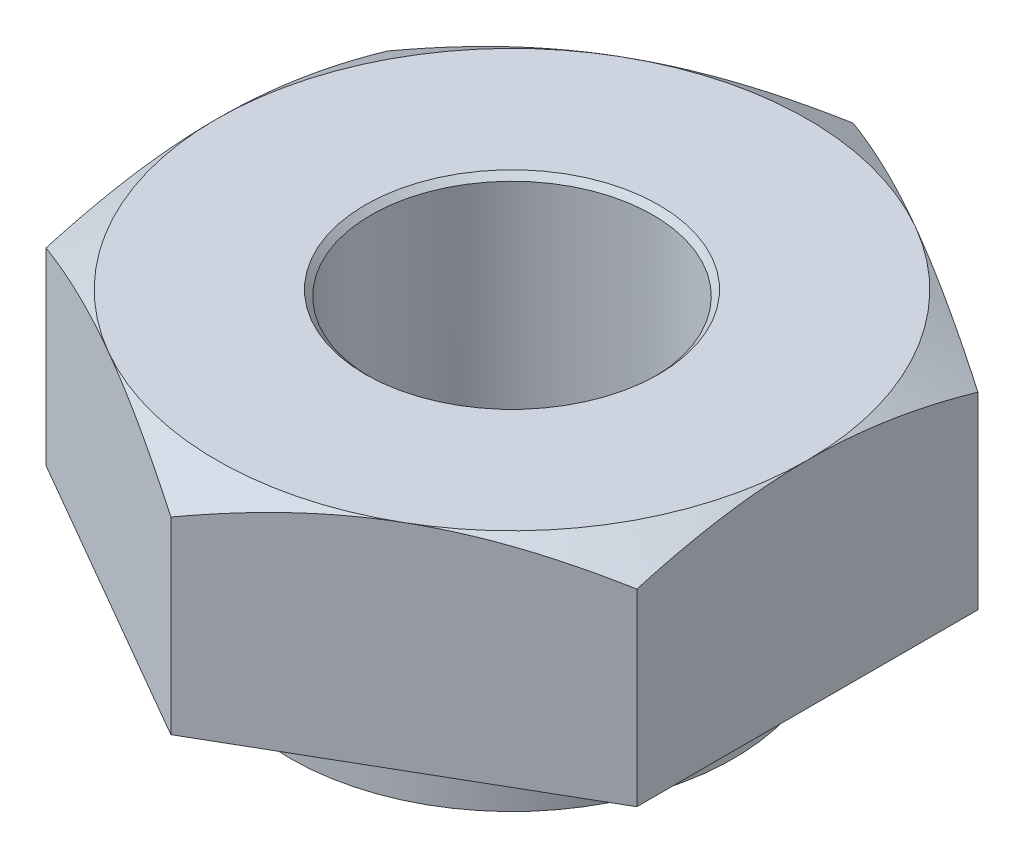
ISO-10303-21;
HEADER;
FILE_DESCRIPTION(('STEP AP214'),'2;1');
FILE_NAME('part.step','',(''),(''),'','','');
FILE_SCHEMA(('AUTOMOTIVE_DESIGN { 1 0 10303 214 1 1 1 1 }'));
ENDSEC;
DATA;
#1=APPLICATION_CONTEXT('core data for automotive mechanical design processes');
#2=APPLICATION_PROTOCOL_DEFINITION('international standard','automotive_design',2000,#1);
#3=PRODUCT_CONTEXT('',#1,'mechanical');
#4=PRODUCT('Part','Part','',(#3));
#5=PRODUCT_RELATED_PRODUCT_CATEGORY('part','',(#4));
#6=PRODUCT_DEFINITION_FORMATION('','',#4);
#7=PRODUCT_DEFINITION_CONTEXT('part definition',#1,'design');
#8=PRODUCT_DEFINITION('design','',#6,#7);
#9=PRODUCT_DEFINITION_SHAPE('','',#8);
#10=(LENGTH_UNIT() NAMED_UNIT(*) SI_UNIT(.MILLI.,.METRE.));
#11=(NAMED_UNIT(*) PLANE_ANGLE_UNIT() SI_UNIT($,.RADIAN.));
#12=(NAMED_UNIT(*) SI_UNIT($,.STERADIAN.) SOLID_ANGLE_UNIT());
#13=UNCERTAINTY_MEASURE_WITH_UNIT(LENGTH_MEASURE(1.E-05),#10,'distance_accuracy_value','');
#14=(GEOMETRIC_REPRESENTATION_CONTEXT(3) GLOBAL_UNCERTAINTY_ASSIGNED_CONTEXT((#13)) GLOBAL_UNIT_ASSIGNED_CONTEXT((#10,
#11,#12)) REPRESENTATION_CONTEXT('',''));
#15=CARTESIAN_POINT('',(0.,0.,0.));
#16=DIRECTION('',(0.,0.,1.));
#17=DIRECTION('',(1.,0.,0.));
#18=AXIS2_PLACEMENT_3D('',#15,#16,#17);
#19=CARTESIAN_POINT('',(4.365625,4.365625,-2.52049476893096));
#20=DIRECTION('',(-0.5,0.,0.866025403784439));
#21=DIRECTION('',(0.866025403784439,0.,0.5));
#22=AXIS2_PLACEMENT_3D('',#19,#20,#21);
#23=PLANE('',#22);
#24=DIRECTION('',(0.,-1.,0.));
#25=VECTOR('',#24,1.);
#26=CARTESIAN_POINT('',(4.365625,4.365625,-2.52049476893096));
#27=LINE('',#26,#25);
#28=CARTESIAN_POINT('',(4.365625,3.97570310226438,-2.52049476893108));
#29=VERTEX_POINT('',#28);
#30=CARTESIAN_POINT('',(4.365625,1.190625,-2.52049476893096));
#31=VERTEX_POINT('',#30);
#32=EDGE_CURVE('E119',#29,#31,#27,.T.);
#33=ORIENTED_EDGE('',*,*,#32,.T.);
#34=DIRECTION('',(-0.866025403784439,0.,-0.5));
#35=VECTOR('',#34,1.);
#36=CARTESIAN_POINT('',(4.365625,1.190625,-2.52049476893096));
#37=LINE('',#36,#35);
#38=CARTESIAN_POINT('',(0.,1.190625,-5.04098953786192));
#39=VERTEX_POINT('',#38);
#40=EDGE_CURVE('E50',#31,#39,#37,.T.);
#41=ORIENTED_EDGE('',*,*,#40,.T.);
#42=DIRECTION('',(0.,-1.,0.));
#43=VECTOR('',#42,1.);
#44=CARTESIAN_POINT('',(0.,4.365625,-5.04098953786192));
#45=LINE('',#44,#43);
#46=CARTESIAN_POINT('',(0.,3.9757031022643,-5.04098953786192));
#47=VERTEX_POINT('',#46);
#48=EDGE_CURVE('E116',#47,#39,#45,.T.);
#49=ORIENTED_EDGE('',*,*,#48,.F.);
#50=CARTESIAN_POINT('',(4.365825,3.97563643330706,-2.52037929887712));
#51=CARTESIAN_POINT('',(4.17397884524337,4.03960803939287,-2.63114172796886));
#52=CARTESIAN_POINT('',(3.98047668465206,4.09778770339327,-2.74286025247502));
#53=CARTESIAN_POINT('',(3.5901217278633,4.1993404789496,-2.96823179185652));
#54=CARTESIAN_POINT('',(3.39326199603345,4.24267766558374,-3.08188881102108));
#55=CARTESIAN_POINT('',(3.00198221769429,4.31013774711872,-3.30779429637365));
#56=CARTESIAN_POINT('',(2.80762237147349,4.3347096340745,-3.42000800590889));
#57=CARTESIAN_POINT('',(2.41798823215203,4.36404239318914,-3.6449633811316));
#58=CARTESIAN_POINT('',(2.2227153550983,4.3688275564277,-3.757704229264));
#59=CARTESIAN_POINT('',(1.85784257149213,4.35886837568916,-3.96836362909899));
#60=CARTESIAN_POINT('',(1.68818802211312,4.34656934705368,-4.06631372885221));
#61=CARTESIAN_POINT('',(1.34998421225434,4.30759000734802,-4.26157578951513));
#62=CARTESIAN_POINT('',(1.18143612140105,4.28089638313893,-4.35888707514068));
#63=CARTESIAN_POINT('',(0.842535099477599,4.21416492336617,-4.55455167137682));
#64=CARTESIAN_POINT('',(0.672225057879174,4.17384423834841,-4.65288021973937));
#65=CARTESIAN_POINT('',(0.334144990416697,4.08233234471812,-4.84807083769648));
#66=CARTESIAN_POINT('',(0.166370633837114,4.03116263580727,-4.94493540763081));
#67=CARTESIAN_POINT('',(-0.000200000000000026,3.97563643330706,-5.04110500791576));
#68=B_SPLINE_CURVE_WITH_KNOTS('',3,(#50,#51,#52,#53,#54,#55,#56,#57,#58,#59,#60,#61,#62,#63,#64,
#65,#66,#67),.UNSPECIFIED.,.F.,.F.,(4,2,2,2,2,2,2,2,4),(0.,0.692002325262095,1.38566793682621,
2.06216593124082,2.73783317900963,3.32613108280982,3.91497402160196,4.51687782793767,
5.11759979729738),.UNSPECIFIED.);
#69=CARTESIAN_POINT('',(2.1828125,4.365625,-3.78074215339644));
#70=VERTEX_POINT('',#69);
#71=EDGE_CURVE('E210',#70,#47,#68,.T.);
#72=ORIENTED_EDGE('',*,*,#71,.F.);
#73=EDGE_CURVE('E336',#29,#70,#68,.T.);
#74=ORIENTED_EDGE('',*,*,#73,.F.);
#75=EDGE_LOOP('',(#33,#41,#49,#72,#74));
#76=FACE_BOUND('',#75,.T.);
#77=ADVANCED_FACE('F35',(#76),#23,.F.);
#78=CARTESIAN_POINT('',(0.,4.365625,-5.04098953786192));
#79=DIRECTION('',(0.5,0.,0.866025403784439));
#80=DIRECTION('',(0.866025403784439,0.,-0.5));
#81=AXIS2_PLACEMENT_3D('',#78,#79,#80);
#82=PLANE('',#81);
#83=ORIENTED_EDGE('',*,*,#48,.T.);
#84=DIRECTION('',(-0.866025403784439,0.,0.5));
#85=VECTOR('',#84,1.);
#86=CARTESIAN_POINT('',(0.,1.190625,-5.04098953786192));
#87=LINE('',#86,#85);
#88=CARTESIAN_POINT('',(-4.365625,1.190625,-2.52049476893097));
#89=VERTEX_POINT('',#88);
#90=EDGE_CURVE('E103',#39,#89,#87,.T.);
#91=ORIENTED_EDGE('',*,*,#90,.T.);
#92=DIRECTION('',(0.,-1.,0.));
#93=VECTOR('',#92,1.);
#94=CARTESIAN_POINT('',(-4.365625,4.365625,-2.52049476893096));
#95=LINE('',#94,#93);
#96=CARTESIAN_POINT('',(-4.365625,3.97570310226438,-2.52049476893108));
#97=VERTEX_POINT('',#96);
#98=EDGE_CURVE('E127',#97,#89,#95,.T.);
#99=ORIENTED_EDGE('',*,*,#98,.F.);
#100=CARTESIAN_POINT('',(0.000200000000000096,3.97563643330706,-5.04110500791576));
#101=CARTESIAN_POINT('',(-0.191646154756632,4.03960803939287,-4.93034257882402));
#102=CARTESIAN_POINT('',(-0.385148315347934,4.09778770339327,-4.81862405431786));
#103=CARTESIAN_POINT('',(-0.775503272136697,4.1993404789496,-4.59325251493636));
#104=CARTESIAN_POINT('',(-0.97236300396655,4.24267766558374,-4.4795954957718));
#105=CARTESIAN_POINT('',(-1.36364278230571,4.31013774711872,-4.25369001041923));
#106=CARTESIAN_POINT('',(-1.55800262852651,4.3347096340745,-4.141476300884));
#107=CARTESIAN_POINT('',(-1.94763676784797,4.36404239318914,-3.91652092566128));
#108=CARTESIAN_POINT('',(-2.1429096449017,4.3688275564277,-3.80378007752888));
#109=CARTESIAN_POINT('',(-2.50778242850786,4.35886837568916,-3.59312067769389));
#110=CARTESIAN_POINT('',(-2.67743697788687,4.34656934705368,-3.49517057794068));
#111=CARTESIAN_POINT('',(-3.01564078774565,4.30759000734802,-3.29990851727775));
#112=CARTESIAN_POINT('',(-3.18418887859895,4.28089638313893,-3.2025972316522));
#113=CARTESIAN_POINT('',(-3.5230899005224,4.21416492336617,-3.00693263541606));
#114=CARTESIAN_POINT('',(-3.69339994212082,4.17384423834841,-2.90860408705351));
#115=CARTESIAN_POINT('',(-4.0314800095833,4.08233234471812,-2.7134134690964));
#116=CARTESIAN_POINT('',(-4.19925436616289,4.03116263580728,-2.61654889916207));
#117=CARTESIAN_POINT('',(-4.365825,3.97563643330706,-2.52037929887712));
#118=B_SPLINE_CURVE_WITH_KNOTS('',3,(#100,#101,#102,#103,#104,#105,#106,#107,#108,#109,#110,
#111,#112,#113,#114,#115,#116,#117),.UNSPECIFIED.,.F.,.F.,(4,2,2,2,2,2,2,2,4),(0.,
0.692002325262095,1.38566793682621,2.06216593124082,2.73783317900963,3.32613108280982,
3.91497402160196,4.51687782793768,5.11759979729738),.UNSPECIFIED.);
#119=CARTESIAN_POINT('',(-2.1828125,4.365625,-3.78074215339644));
#120=VERTEX_POINT('',#119);
#121=EDGE_CURVE('E204',#120,#97,#118,.T.);
#122=ORIENTED_EDGE('',*,*,#121,.F.);
#123=EDGE_CURVE('E125',#47,#120,#118,.T.);
#124=ORIENTED_EDGE('',*,*,#123,.F.);
#125=EDGE_LOOP('',(#83,#91,#99,#122,#124));
#126=FACE_BOUND('',#125,.T.);
#127=ADVANCED_FACE('F123',(#126),#82,.F.);
#128=CARTESIAN_POINT('',(-4.365625,4.365625,-2.52049476893096));
#129=DIRECTION('',(1.,0.,0.));
#130=DIRECTION('',(0.,0.,-1.));
#131=AXIS2_PLACEMENT_3D('',#128,#129,#130);
#132=PLANE('',#131);
#133=ORIENTED_EDGE('',*,*,#98,.T.);
#134=DIRECTION('',(0.,0.,1.));
#135=VECTOR('',#134,1.);
#136=CARTESIAN_POINT('',(-4.365625,1.190625,-2.52049476893096));
#137=LINE('',#136,#135);
#138=CARTESIAN_POINT('',(-4.365625,1.19062499999999,2.52049476893096));
#139=VERTEX_POINT('',#138);
#140=EDGE_CURVE('E106',#89,#139,#137,.T.);
#141=ORIENTED_EDGE('',*,*,#140,.T.);
#142=DIRECTION('',(0.,-1.,0.));
#143=VECTOR('',#142,1.);
#144=CARTESIAN_POINT('',(-4.365625,4.365625,2.52049476893096));
#145=LINE('',#144,#143);
#146=CARTESIAN_POINT('',(-4.365625,3.9757031022643,2.52049476893096));
#147=VERTEX_POINT('',#146);
#148=EDGE_CURVE('E132',#147,#139,#145,.T.);
#149=ORIENTED_EDGE('',*,*,#148,.F.);
#150=CARTESIAN_POINT('',(-4.365625,2.16572492391831,-6.91286487918296));
#151=CARTESIAN_POINT('',(-4.365625,2.25939640330489,-6.72092648409264));
#152=CARTESIAN_POINT('',(-4.365625,2.35220994582686,-6.52856244945873));
#153=CARTESIAN_POINT('',(-4.365625,2.53564124723088,-6.14275722466381));
#154=CARTESIAN_POINT('',(-4.365625,2.62625868579093,-5.94931588236799));
#155=CARTESIAN_POINT('',(-4.365625,2.80524365491005,-5.5602003718446));
#156=CARTESIAN_POINT('',(-4.365625,2.89359742579855,-5.36451985359358));
#157=CARTESIAN_POINT('',(-4.365625,3.06687407175193,-4.97165125492876));
#158=CARTESIAN_POINT('',(-4.365625,3.15179710002251,-4.77446324230341));
#159=CARTESIAN_POINT('',(-4.365625,3.32017003092573,-4.37142262621219));
#160=CARTESIAN_POINT('',(-4.365625,3.40346763443347,-4.16550606509893));
#161=CARTESIAN_POINT('',(-4.365625,3.56409666510129,-3.75131708170349));
#162=CARTESIAN_POINT('',(-4.365625,3.64142744315579,-3.54304440592748));
#163=CARTESIAN_POINT('',(-4.365625,3.78819674807172,-3.12415754336475));
#164=CARTESIAN_POINT('',(-4.365625,3.85765008517104,-2.91354859615939));
#165=CARTESIAN_POINT('',(-4.365625,3.98653079619726,-2.48931284525827));
#166=CARTESIAN_POINT('',(-4.365625,4.04596118051565,-2.27568696866249));
#167=CARTESIAN_POINT('',(-4.365625,4.15172155816293,-1.84648791656792));
#168=CARTESIAN_POINT('',(-4.365625,4.19812629326434,-1.63093349319846));
#169=CARTESIAN_POINT('',(-4.365625,4.27531019510395,-1.1970012210497));
#170=CARTESIAN_POINT('',(-4.365625,4.30609111295987,-0.978623691498865));
#171=CARTESIAN_POINT('',(-4.365625,4.34917706920352,-0.543043666964697));
#172=CARTESIAN_POINT('',(-4.365625,4.36173059768355,-0.325866375264969));
#173=CARTESIAN_POINT('',(-4.365625,4.36796158588117,0.108783677786554));
#174=CARTESIAN_POINT('',(-4.365625,4.36163884772114,0.326256442211867));
#175=CARTESIAN_POINT('',(-4.365625,4.33564006573077,0.691321614157379));
#176=CARTESIAN_POINT('',(-4.365625,4.32081408812231,0.8392839207881));
#177=CARTESIAN_POINT('',(-4.365625,4.28327272636649,1.13421073362511));
#178=CARTESIAN_POINT('',(-4.365625,4.26055638826924,1.28117511699037));
#179=CARTESIAN_POINT('',(-4.365625,4.18175717110547,1.72032394223359));
#180=CARTESIAN_POINT('',(-4.365625,4.11503535369022,2.01062534550366));
#181=CARTESIAN_POINT('',(-4.365625,3.998231496302,2.44499178314794));
#182=CARTESIAN_POINT('',(-4.365625,3.95592239433218,2.59127602608044));
#183=CARTESIAN_POINT('',(-4.365625,3.86663520230625,2.88242647249444));
#184=CARTESIAN_POINT('',(-4.365625,3.81965707493026,3.02729266463119));
#185=CARTESIAN_POINT('',(-4.365625,3.72180823318134,3.31564955019008));
#186=CARTESIAN_POINT('',(-4.365625,3.67093854782101,3.45914059601571));
#187=CARTESIAN_POINT('',(-4.365625,3.56593233241395,3.74491408963176));
#188=CARTESIAN_POINT('',(-4.365625,3.51179588580739,3.88719656818582));
#189=CARTESIAN_POINT('',(-4.365625,3.35825599775331,4.27934008293896));
#190=CARTESIAN_POINT('',(-4.365625,3.25596105343501,4.52806806625827));
#191=CARTESIAN_POINT('',(-4.365625,3.04511006757158,5.02286623174984));
#192=CARTESIAN_POINT('',(-4.365625,2.93655324949615,5.26893607977706));
#193=CARTESIAN_POINT('',(-4.365625,2.71470144477202,5.75904913604779));
#194=CARTESIAN_POINT('',(-4.365625,2.60140446291119,6.00309143799433));
#195=CARTESIAN_POINT('',(-4.365625,2.37123826126673,6.489465773805));
#196=CARTESIAN_POINT('',(-4.365625,2.25436920579252,6.73179788570576));
#197=CARTESIAN_POINT('',(-4.365625,2.0176526640704,7.21552016103529));
#198=CARTESIAN_POINT('',(-4.365625,1.89780037219463,7.45690796773571));
#199=CARTESIAN_POINT('',(-4.365625,1.65589745434077,7.93858025300455));
#200=CARTESIAN_POINT('',(-4.365625,1.53384680760269,8.17886472112679));
#201=CARTESIAN_POINT('',(-4.365625,1.16514515877594,8.89826072499817));
#202=CARTESIAN_POINT('',(-4.365625,0.915885312273444,9.37603448937885));
#203=CARTESIAN_POINT('',(-4.365625,0.4405080584456,10.2765865021301));
#204=CARTESIAN_POINT('',(-4.365625,0.214869980290046,10.6996190313308));
#205=CARTESIAN_POINT('',(-4.365625,-0.239078846783825,11.5442843842997));
#206=CARTESIAN_POINT('',(-4.365625,-0.467389778110095,11.9659171099886));
#207=CARTESIAN_POINT('',(-4.365625,-0.925162645350592,12.8066083777368));
#208=CARTESIAN_POINT('',(-4.365625,-1.15461757917514,13.2256707385857));
#209=CARTESIAN_POINT('',(-4.365625,-1.61502984154572,14.0629229586093));
#210=CARTESIAN_POINT('',(-4.365625,-1.8459870398419,14.4811128893808));
#211=CARTESIAN_POINT('',(-4.365625,-2.07748916003773,14.8989990755701));
#212=B_SPLINE_CURVE_WITH_KNOTS('',3,(#150,#151,#152,#153,#154,#155,#156,#157,#158,#159,#160,
#161,#162,#163,#164,#165,#166,#167,#168,#169,#170,#171,#172,#173,#174,#175,#176,#177,#178,#179,
#180,#181,#182,#183,#184,#185,#186,#187,#188,#189,#190,#191,#192,#193,#194,#195,#196,#197,#198,
#199,#200,#201,#202,#203,#204,#205,#206,#207,#208,#209,#210,#211),.UNSPECIFIED.,.F.,.F.,(4,2,2,
2,2,2,2,2,2,2,2,2,2,2,2,2,2,2,2,2,2,2,2,2,2,2,2,2,2,2,4),(0.,0.640735072414176,1.28156304621455,
1.92564473388348,2.56969762711278,3.23600516229573,3.90238508034855,4.56749062076778,
5.23239603975488,5.89340434659905,6.55433855125207,7.20617492786333,7.85801813762045,
8.30391427557797,8.74986434145344,9.642180067483,10.0989767257157,10.5557770354523,
11.012456971994,11.4691252488727,12.2758210650901,13.0826171350242,13.8897562840622,
14.6968583617544,15.5053575789474,16.3138644351402,17.9304778503338,19.3688081282348,
20.8072371434243,22.2405396587169,23.6737195171869),.UNSPECIFIED.);
#213=CARTESIAN_POINT('',(-4.365625,4.365625,0.));
#214=VERTEX_POINT('',#213);
#215=EDGE_CURVE('E197',#214,#147,#212,.T.);
#216=ORIENTED_EDGE('',*,*,#215,.F.);
#217=EDGE_CURVE('E203',#97,#214,#212,.T.);
#218=ORIENTED_EDGE('',*,*,#217,.F.);
#219=EDGE_LOOP('',(#133,#141,#149,#216,#218));
#220=FACE_BOUND('',#219,.T.);
#221=ADVANCED_FACE('F186',(#220),#132,.F.);
#222=CARTESIAN_POINT('',(-4.365625,4.365625,2.52049476893096));
#223=DIRECTION('',(0.5,0.,-0.866025403784439));
#224=DIRECTION('',(-0.866025403784439,0.,-0.5));
#225=AXIS2_PLACEMENT_3D('',#222,#223,#224);
#226=PLANE('',#225);
#227=ORIENTED_EDGE('',*,*,#148,.T.);
#228=DIRECTION('',(0.866025403784439,0.,0.5));
#229=VECTOR('',#228,1.);
#230=CARTESIAN_POINT('',(-4.365625,1.190625,2.52049476893096));
#231=LINE('',#230,#229);
#232=CARTESIAN_POINT('',(0.,1.19062499999999,5.04098953786192));
#233=VERTEX_POINT('',#232);
#234=EDGE_CURVE('E410',#139,#233,#231,.T.);
#235=ORIENTED_EDGE('',*,*,#234,.T.);
#236=DIRECTION('',(0.,-1.,0.));
#237=VECTOR('',#236,1.);
#238=CARTESIAN_POINT('',(0.,4.365625,5.04098953786192));
#239=LINE('',#238,#237);
#240=CARTESIAN_POINT('',(0.,3.9757031022643,5.04098953786192));
#241=VERTEX_POINT('',#240);
#242=EDGE_CURVE('E354',#241,#233,#239,.T.);
#243=ORIENTED_EDGE('',*,*,#242,.F.);
#244=CARTESIAN_POINT('',(-4.365825,3.97563643330706,2.52037929887712));
#245=CARTESIAN_POINT('',(-4.17397884524337,4.03960803939287,2.63114172796886));
#246=CARTESIAN_POINT('',(-3.98047668465207,4.09778770339327,2.74286025247502));
#247=CARTESIAN_POINT('',(-3.5901217278633,4.1993404789496,2.96823179185652));
#248=CARTESIAN_POINT('',(-3.39326199603345,4.24267766558374,3.08188881102108));
#249=CARTESIAN_POINT('',(-3.00198221769429,4.31013774711872,3.30779429637365));
#250=CARTESIAN_POINT('',(-2.80762237147349,4.3347096340745,3.42000800590889));
#251=CARTESIAN_POINT('',(-2.41798823215203,4.36404239318914,3.6449633811316));
#252=CARTESIAN_POINT('',(-2.2227153550983,4.3688275564277,3.757704229264));
#253=CARTESIAN_POINT('',(-1.85784257149214,4.35886837568916,3.96836362909899));
#254=CARTESIAN_POINT('',(-1.68818802211313,4.34656934705368,4.0663137288522));
#255=CARTESIAN_POINT('',(-1.34998421225435,4.30759000734802,4.26157578951513));
#256=CARTESIAN_POINT('',(-1.18143612140105,4.28089638313893,4.35888707514068));
#257=CARTESIAN_POINT('',(-0.842535099477601,4.21416492336617,4.55455167137682));
#258=CARTESIAN_POINT('',(-0.672225057879175,4.17384423834841,4.65288021973937));
#259=CARTESIAN_POINT('',(-0.334144990416697,4.08233234471812,4.84807083769647));
#260=CARTESIAN_POINT('',(-0.166370633837114,4.03116263580728,4.94493540763081));
#261=CARTESIAN_POINT('',(0.000199999999999226,3.97563643330706,5.04110500791576));
#262=B_SPLINE_CURVE_WITH_KNOTS('',3,(#244,#245,#246,#247,#248,#249,#250,#251,#252,#253,#254,
#255,#256,#257,#258,#259,#260,#261),.UNSPECIFIED.,.F.,.F.,(4,2,2,2,2,2,2,2,4),(0.,
0.692002325262094,1.38566793682621,2.06216593124082,2.73783317900963,3.32613108280982,
3.91497402160196,4.51687782793768,5.11759979729738),.UNSPECIFIED.);
#263=CARTESIAN_POINT('',(-2.1828125,4.365625,3.78074215339644));
#264=VERTEX_POINT('',#263);
#265=EDGE_CURVE('E189',#264,#241,#262,.T.);
#266=ORIENTED_EDGE('',*,*,#265,.F.);
#267=EDGE_CURVE('E195',#147,#264,#262,.T.);
#268=ORIENTED_EDGE('',*,*,#267,.F.);
#269=EDGE_LOOP('',(#227,#235,#243,#266,#268));
#270=FACE_BOUND('',#269,.T.);
#271=ADVANCED_FACE('F181',(#270),#226,.F.);
#272=CARTESIAN_POINT('',(0.,4.365625,5.04098953786192));
#273=DIRECTION('',(-0.5,0.,-0.866025403784439));
#274=DIRECTION('',(-0.866025403784439,0.,0.5));
#275=AXIS2_PLACEMENT_3D('',#272,#273,#274);
#276=PLANE('',#275);
#277=ORIENTED_EDGE('',*,*,#242,.T.);
#278=DIRECTION('',(0.866025403784439,0.,-0.5));
#279=VECTOR('',#278,1.);
#280=CARTESIAN_POINT('',(0.,1.19062499999999,5.04098953786192));
#281=LINE('',#280,#279);
#282=CARTESIAN_POINT('',(4.365625,1.19062499999999,2.52049476893097));
#283=VERTEX_POINT('',#282);
#284=EDGE_CURVE('E413',#233,#283,#281,.T.);
#285=ORIENTED_EDGE('',*,*,#284,.T.);
#286=DIRECTION('',(0.,-1.,0.));
#287=VECTOR('',#286,1.);
#288=CARTESIAN_POINT('',(4.365625,4.365625,2.52049476893096));
#289=LINE('',#288,#287);
#290=CARTESIAN_POINT('',(4.365625,3.9757031022643,2.52049476893096));
#291=VERTEX_POINT('',#290);
#292=EDGE_CURVE('E332',#291,#283,#289,.T.);
#293=ORIENTED_EDGE('',*,*,#292,.F.);
#294=CARTESIAN_POINT('',(-0.00020000000000095,3.97563643330706,5.04110500791576));
#295=CARTESIAN_POINT('',(0.191646154756631,4.03960803939287,4.93034257882402));
#296=CARTESIAN_POINT('',(0.385148315347933,4.09778770339327,4.81862405431786));
#297=CARTESIAN_POINT('',(0.775503272136696,4.1993404789496,4.59325251493636));
#298=CARTESIAN_POINT('',(0.972363003966549,4.24267766558374,4.4795954957718));
#299=CARTESIAN_POINT('',(1.36364278230571,4.31013774711872,4.25369001041923));
#300=CARTESIAN_POINT('',(1.55800262852651,4.3347096340745,4.141476300884));
#301=CARTESIAN_POINT('',(1.94763676784797,4.36404239318914,3.91652092566128));
#302=CARTESIAN_POINT('',(2.1429096449017,4.3688275564277,3.80378007752888));
#303=CARTESIAN_POINT('',(2.50778242850786,4.35886837568916,3.59312067769389));
#304=CARTESIAN_POINT('',(2.67743697788687,4.34656934705368,3.49517057794068));
#305=CARTESIAN_POINT('',(3.01564078774565,4.30759000734802,3.29990851727775));
#306=CARTESIAN_POINT('',(3.18418887859895,4.28089638313893,3.2025972316522));
#307=CARTESIAN_POINT('',(3.5230899005224,4.21416492336617,3.00693263541606));
#308=CARTESIAN_POINT('',(3.69339994212082,4.17384423834841,2.90860408705351));
#309=CARTESIAN_POINT('',(4.0314800095833,4.08233234471812,2.7134134690964));
#310=CARTESIAN_POINT('',(4.19925436616289,4.03116263580728,2.61654889916207));
#311=CARTESIAN_POINT('',(4.365825,3.97563643330706,2.52037929887712));
#312=B_SPLINE_CURVE_WITH_KNOTS('',3,(#294,#295,#296,#297,#298,#299,#300,#301,#302,#303,#304,
#305,#306,#307,#308,#309,#310,#311),.UNSPECIFIED.,.F.,.F.,(4,2,2,2,2,2,2,2,4),(0.,
0.692002325262095,1.38566793682621,2.06216593124082,2.73783317900963,3.32613108280982,
3.91497402160196,4.51687782793768,5.11759979729738),.UNSPECIFIED.);
#313=CARTESIAN_POINT('',(2.1828125,4.365625,3.78074215339644));
#314=VERTEX_POINT('',#313);
#315=EDGE_CURVE('E160',#314,#291,#312,.T.);
#316=ORIENTED_EDGE('',*,*,#315,.F.);
#317=EDGE_CURVE('E196',#241,#314,#312,.T.);
#318=ORIENTED_EDGE('',*,*,#317,.F.);
#319=EDGE_LOOP('',(#277,#285,#293,#316,#318));
#320=FACE_BOUND('',#319,.T.);
#321=ADVANCED_FACE('F176',(#320),#276,.F.);
#322=CARTESIAN_POINT('',(4.365625,4.365625,2.52049476893096));
#323=DIRECTION('',(-1.,0.,0.));
#324=DIRECTION('',(0.,0.,1.));
#325=AXIS2_PLACEMENT_3D('',#322,#323,#324);
#326=PLANE('',#325);
#327=ORIENTED_EDGE('',*,*,#292,.T.);
#328=DIRECTION('',(0.,0.,-1.));
#329=VECTOR('',#328,1.);
#330=CARTESIAN_POINT('',(4.365625,1.190625,2.52049476893096));
#331=LINE('',#330,#329);
#332=EDGE_CURVE('E12',#283,#31,#331,.T.);
#333=ORIENTED_EDGE('',*,*,#332,.T.);
#334=ORIENTED_EDGE('',*,*,#32,.F.);
#335=CARTESIAN_POINT('',(4.365625,2.16572492391831,-6.91286487918296));
#336=CARTESIAN_POINT('',(4.365625,2.25939640330489,-6.72092648409264));
#337=CARTESIAN_POINT('',(4.365625,2.35220994582686,-6.52856244945873));
#338=CARTESIAN_POINT('',(4.365625,2.53564124723088,-6.14275722466381));
#339=CARTESIAN_POINT('',(4.365625,2.62625868579093,-5.94931588236799));
#340=CARTESIAN_POINT('',(4.365625,2.80524365491005,-5.5602003718446));
#341=CARTESIAN_POINT('',(4.365625,2.89359742579855,-5.36451985359358));
#342=CARTESIAN_POINT('',(4.365625,3.06687407175193,-4.97165125492876));
#343=CARTESIAN_POINT('',(4.365625,3.15179710002251,-4.77446324230341));
#344=CARTESIAN_POINT('',(4.365625,3.32017003092573,-4.37142262621219));
#345=CARTESIAN_POINT('',(4.365625,3.40346763443347,-4.16550606509893));
#346=CARTESIAN_POINT('',(4.365625,3.56409666510129,-3.75131708170349));
#347=CARTESIAN_POINT('',(4.365625,3.6414274431558,-3.54304440592748));
#348=CARTESIAN_POINT('',(4.365625,3.78819674807172,-3.12415754336475));
#349=CARTESIAN_POINT('',(4.365625,3.85765008517104,-2.9135485961594));
#350=CARTESIAN_POINT('',(4.365625,3.98653079619726,-2.48931284525827));
#351=CARTESIAN_POINT('',(4.365625,4.04596118051565,-2.2756869686625));
#352=CARTESIAN_POINT('',(4.365625,4.15172155816293,-1.84648791656792));
#353=CARTESIAN_POINT('',(4.365625,4.19812629326434,-1.63093349319847));
#354=CARTESIAN_POINT('',(4.365625,4.27531019510395,-1.19700122104971));
#355=CARTESIAN_POINT('',(4.365625,4.30609111295987,-0.978623691498867));
#356=CARTESIAN_POINT('',(4.365625,4.34917706920352,-0.5430436669647));
#357=CARTESIAN_POINT('',(4.365625,4.36173059768355,-0.325866375264972));
#358=CARTESIAN_POINT('',(4.365625,4.36796158588117,0.108783677786551));
#359=CARTESIAN_POINT('',(4.365625,4.36163884772114,0.326256442211865));
#360=CARTESIAN_POINT('',(4.365625,4.33564006573077,0.691321614157378));
#361=CARTESIAN_POINT('',(4.365625,4.32081408812231,0.839283920788098));
#362=CARTESIAN_POINT('',(4.365625,4.28327272636649,1.1342107336251));
#363=CARTESIAN_POINT('',(4.365625,4.26055638826924,1.28117511699037));
#364=CARTESIAN_POINT('',(4.365625,4.18175717110547,1.72032394223359));
#365=CARTESIAN_POINT('',(4.365625,4.11503535369022,2.01062534550366));
#366=CARTESIAN_POINT('',(4.365625,3.998231496302,2.44499178314793));
#367=CARTESIAN_POINT('',(4.365625,3.95592239433218,2.59127602608044));
#368=CARTESIAN_POINT('',(4.365625,3.86663520230625,2.88242647249444));
#369=CARTESIAN_POINT('',(4.365625,3.81965707493026,3.02729266463119));
#370=CARTESIAN_POINT('',(4.365625,3.72180823318134,3.31564955019008));
#371=CARTESIAN_POINT('',(4.365625,3.67093854782101,3.45914059601571));
#372=CARTESIAN_POINT('',(4.365625,3.56593233241395,3.74491408963176));
#373=CARTESIAN_POINT('',(4.365625,3.51179588580739,3.88719656818582));
#374=CARTESIAN_POINT('',(4.365625,3.35825599775331,4.27934008293895));
#375=CARTESIAN_POINT('',(4.365625,3.25596105343501,4.52806806625827));
#376=CARTESIAN_POINT('',(4.365625,3.04511006757158,5.02286623174984));
#377=CARTESIAN_POINT('',(4.365625,2.93655324949615,5.26893607977706));
#378=CARTESIAN_POINT('',(4.365625,2.71470144477202,5.75904913604779));
#379=CARTESIAN_POINT('',(4.365625,2.60140446291119,6.00309143799433));
#380=CARTESIAN_POINT('',(4.365625,2.37123826126673,6.489465773805));
#381=CARTESIAN_POINT('',(4.365625,2.25436920579252,6.73179788570576));
#382=CARTESIAN_POINT('',(4.365625,2.0176526640704,7.21552016103529));
#383=CARTESIAN_POINT('',(4.365625,1.89780037219463,7.4569079677357));
#384=CARTESIAN_POINT('',(4.365625,1.65589745434077,7.93858025300455));
#385=CARTESIAN_POINT('',(4.365625,1.53384680760269,8.17886472112678));
#386=CARTESIAN_POINT('',(4.365625,1.16514515877594,8.89826072499817));
#387=CARTESIAN_POINT('',(4.365625,0.915885312273445,9.37603448937885));
#388=CARTESIAN_POINT('',(4.365625,0.440508058445601,10.2765865021301));
#389=CARTESIAN_POINT('',(4.365625,0.214869980290047,10.6996190313308));
#390=CARTESIAN_POINT('',(4.365625,-0.239078846783825,11.5442843842997));
#391=CARTESIAN_POINT('',(4.365625,-0.467389778110095,11.9659171099886));
#392=CARTESIAN_POINT('',(4.365625,-0.92516264535059,12.8066083777368));
#393=CARTESIAN_POINT('',(4.365625,-1.15461757917514,13.2256707385857));
#394=CARTESIAN_POINT('',(4.365625,-1.61502984154572,14.0629229586093));
#395=CARTESIAN_POINT('',(4.365625,-1.8459870398419,14.4811128893808));
#396=CARTESIAN_POINT('',(4.365625,-2.07748916003773,14.8989990755701));
#397=B_SPLINE_CURVE_WITH_KNOTS('',3,(#335,#336,#337,#338,#339,#340,#341,#342,#343,#344,#345,
#346,#347,#348,#349,#350,#351,#352,#353,#354,#355,#356,#357,#358,#359,#360,#361,#362,#363,#364,
#365,#366,#367,#368,#369,#370,#371,#372,#373,#374,#375,#376,#377,#378,#379,#380,#381,#382,#383,
#384,#385,#386,#387,#388,#389,#390,#391,#392,#393,#394,#395,#396),.UNSPECIFIED.,.F.,.F.,(4,2,2,
2,2,2,2,2,2,2,2,2,2,2,2,2,2,2,2,2,2,2,2,2,2,2,2,2,2,2,4),(0.,0.640735072414176,1.28156304621455,
1.92564473388348,2.56969762711278,3.23600516229573,3.90238508034855,4.56749062076778,
5.23239603975488,5.89340434659905,6.55433855125207,7.20617492786333,7.85801813762044,
8.30391427557797,8.74986434145343,9.642180067483,10.0989767257157,10.5557770354522,
11.012456971994,11.4691252488727,12.2758210650901,13.0826171350242,13.8897562840622,
14.6968583617544,15.5053575789474,16.3138644351402,17.9304778503338,19.3688081282348,
20.8072371434243,22.2405396587169,23.6737195171869),.UNSPECIFIED.);
#398=CARTESIAN_POINT('',(4.365625,4.365625,0.));
#399=VERTEX_POINT('',#398);
#400=EDGE_CURVE('E151',#399,#29,#397,.F.);
#401=ORIENTED_EDGE('',*,*,#400,.F.);
#402=EDGE_CURVE('E159',#291,#399,#397,.F.);
#403=ORIENTED_EDGE('',*,*,#402,.F.);
#404=EDGE_LOOP('',(#327,#333,#334,#401,#403));
#405=FACE_BOUND('',#404,.T.);
#406=ADVANCED_FACE('F171',(#405),#326,.F.);
#407=CARTESIAN_POINT('',(0.,0.,-5.04098953786192));
#408=DIRECTION('',(0.,1.,0.));
#409=DIRECTION('',(0.,0.,1.));
#410=AXIS2_PLACEMENT_3D('',#407,#408,#409);
#411=PLANE('',#410);
#412=CARTESIAN_POINT('',(0.,0.,0.));
#413=DIRECTION('',(0.,-1.,0.));
#414=DIRECTION('',(0.,0.,-1.));
#415=AXIS2_PLACEMENT_3D('',#412,#413,#414);
#416=CIRCLE('',#415,3.273425);
#417=CARTESIAN_POINT('',(0.,0.,-3.273425));
#418=VERTEX_POINT('',#417);
#419=EDGE_CURVE('E414',#418,#418,#416,.T.);
#420=ORIENTED_EDGE('',*,*,#419,.T.);
#421=EDGE_LOOP('',(#420));
#422=FACE_BOUND('',#421,.T.);
#423=CARTESIAN_POINT('',(0.,0.,0.));
#424=DIRECTION('',(0.,1.,0.));
#425=DIRECTION('',(0.,0.,1.));
#426=AXIS2_PLACEMENT_3D('',#423,#424,#425);
#427=CIRCLE('',#426,2.16872595803174);
#428=CARTESIAN_POINT('',(0.,0.,2.16872595803174));
#429=VERTEX_POINT('',#428);
#430=EDGE_CURVE('E139',#429,#429,#427,.T.);
#431=ORIENTED_EDGE('',*,*,#430,.T.);
#432=EDGE_LOOP('',(#431));
#433=FACE_BOUND('',#432,.T.);
#434=ADVANCED_FACE('F175',(#422,#433),#411,.F.);
#435=CARTESIAN_POINT('',(0.,4.365625,0.));
#436=DIRECTION('',(0.,-1.,0.));
#437=DIRECTION('',(0.,0.,1.));
#438=AXIS2_PLACEMENT_3D('',#435,#436,#437);
#439=CONICAL_SURFACE('',#438,4.365625,1.0471975511966);
#440=ORIENTED_EDGE('',*,*,#265,.T.);
#441=ORIENTED_EDGE('',*,*,#317,.T.);
#442=CARTESIAN_POINT('',(0.,4.365625,0.));
#443=DIRECTION('',(0.,1.,0.));
#444=DIRECTION('',(0.,0.,1.));
#445=AXIS2_PLACEMENT_3D('',#442,#443,#444);
#446=CIRCLE('',#445,4.365625);
#447=EDGE_CURVE('E126',#264,#314,#446,.T.);
#448=ORIENTED_EDGE('',*,*,#447,.F.);
#449=EDGE_LOOP('',(#440,#441,#448));
#450=FACE_BOUND('',#449,.T.);
#451=ADVANCED_FACE('F270',(#450),#439,.T.);
#452=ORIENTED_EDGE('',*,*,#215,.T.);
#453=ORIENTED_EDGE('',*,*,#267,.T.);
#454=EDGE_CURVE('E130',#214,#264,#446,.T.);
#455=ORIENTED_EDGE('',*,*,#454,.F.);
#456=EDGE_LOOP('',(#452,#453,#455));
#457=FACE_BOUND('',#456,.T.);
#458=ADVANCED_FACE('F352',(#457),#439,.T.);
#459=ORIENTED_EDGE('',*,*,#121,.T.);
#460=ORIENTED_EDGE('',*,*,#217,.T.);
#461=EDGE_CURVE('E344',#120,#214,#446,.T.);
#462=ORIENTED_EDGE('',*,*,#461,.F.);
#463=EDGE_LOOP('',(#459,#460,#462));
#464=FACE_BOUND('',#463,.T.);
#465=ADVANCED_FACE('F345',(#464),#439,.T.);
#466=ORIENTED_EDGE('',*,*,#71,.T.);
#467=ORIENTED_EDGE('',*,*,#123,.T.);
#468=EDGE_CURVE('E342',#70,#120,#446,.T.);
#469=ORIENTED_EDGE('',*,*,#468,.F.);
#470=EDGE_LOOP('',(#466,#467,#469));
#471=FACE_BOUND('',#470,.T.);
#472=ADVANCED_FACE('F340',(#471),#439,.T.);
#473=ORIENTED_EDGE('',*,*,#73,.T.);
#474=EDGE_CURVE('E43',#399,#70,#446,.T.);
#475=ORIENTED_EDGE('',*,*,#474,.F.);
#476=ORIENTED_EDGE('',*,*,#400,.T.);
#477=EDGE_LOOP('',(#473,#475,#476));
#478=FACE_BOUND('',#477,.T.);
#479=ADVANCED_FACE('F167',(#478),#439,.T.);
#480=ORIENTED_EDGE('',*,*,#315,.T.);
#481=ORIENTED_EDGE('',*,*,#402,.T.);
#482=CARTESIAN_POINT('',(0.,4.365625,0.));
#483=DIRECTION('',(0.,1.,0.));
#484=DIRECTION('',(0.,0.,1.));
#485=AXIS2_PLACEMENT_3D('',#482,#483,#484);
#486=CIRCLE('',#485,4.365625);
#487=EDGE_CURVE('E57',#314,#399,#486,.T.);
#488=ORIENTED_EDGE('',*,*,#487,.F.);
#489=EDGE_LOOP('',(#480,#481,#488));
#490=FACE_BOUND('',#489,.T.);
#491=ADVANCED_FACE('F307',(#490),#439,.T.);
#492=CARTESIAN_POINT('',(0.,4.365625,-5.04098953786192));
#493=DIRECTION('',(0.,1.,0.));
#494=DIRECTION('',(0.,0.,1.));
#495=AXIS2_PLACEMENT_3D('',#492,#493,#494);
#496=PLANE('',#495);
#497=CARTESIAN_POINT('',(0.,4.365625,0.));
#498=DIRECTION('',(0.,1.,0.));
#499=DIRECTION('',(0.,0.,1.));
#500=AXIS2_PLACEMENT_3D('',#497,#498,#499);
#501=CIRCLE('',#500,2.16872595803174);
#502=CARTESIAN_POINT('',(0.,4.365625,2.16872595803174));
#503=VERTEX_POINT('',#502);
#504=EDGE_CURVE('E138',#503,#503,#501,.T.);
#505=ORIENTED_EDGE('',*,*,#504,.F.);
#506=EDGE_LOOP('',(#505));
#507=FACE_BOUND('',#506,.T.);
#508=ORIENTED_EDGE('',*,*,#447,.T.);
#509=ORIENTED_EDGE('',*,*,#487,.T.);
#510=ORIENTED_EDGE('',*,*,#474,.T.);
#511=ORIENTED_EDGE('',*,*,#468,.T.);
#512=ORIENTED_EDGE('',*,*,#461,.T.);
#513=ORIENTED_EDGE('',*,*,#454,.T.);
#514=EDGE_LOOP('',(#508,#509,#510,#511,#512,#513));
#515=FACE_BOUND('',#514,.T.);
#516=ADVANCED_FACE('F304',(#507,#515),#496,.T.);
#517=CARTESIAN_POINT('',(0.,0.,0.));
#518=DIRECTION('',(0.,1.,0.));
#519=DIRECTION('',(0.,0.,1.));
#520=AXIS2_PLACEMENT_3D('',#517,#518,#519);
#521=CYLINDRICAL_SURFACE('',#520,2.0828);
#522=CARTESIAN_POINT('',(0.,0.0859259580317384,0.));
#523=DIRECTION('',(0.,-1.,0.));
#524=DIRECTION('',(0.,0.,-1.));
#525=AXIS2_PLACEMENT_3D('',#522,#523,#524);
#526=CIRCLE('',#525,2.0828);
#527=CARTESIAN_POINT('',(0.,0.0859259580317384,-2.0828));
#528=VERTEX_POINT('',#527);
#529=EDGE_CURVE('E120',#528,#528,#526,.T.);
#530=ORIENTED_EDGE('',*,*,#529,.T.);
#531=EDGE_LOOP('',(#530));
#532=FACE_BOUND('',#531,.T.);
#533=CARTESIAN_POINT('',(0.,4.27969904196826,0.));
#534=DIRECTION('',(0.,1.,0.));
#535=DIRECTION('',(0.,0.,1.));
#536=AXIS2_PLACEMENT_3D('',#533,#534,#535);
#537=CIRCLE('',#536,2.0828);
#538=CARTESIAN_POINT('',(0.,4.27969904196826,2.0828));
#539=VERTEX_POINT('',#538);
#540=EDGE_CURVE('E136',#539,#539,#537,.T.);
#541=ORIENTED_EDGE('',*,*,#540,.T.);
#542=EDGE_LOOP('',(#541));
#543=FACE_BOUND('',#542,.T.);
#544=ADVANCED_FACE('F301',(#532,#543),#521,.F.);
#545=CARTESIAN_POINT('',(0.,4.365625,0.));
#546=DIRECTION('',(0.,1.,0.));
#547=DIRECTION('',(0.,0.,1.));
#548=AXIS2_PLACEMENT_3D('',#545,#546,#547);
#549=CONICAL_SURFACE('',#548,2.16872595803174,0.78539816339745);
#550=ORIENTED_EDGE('',*,*,#504,.T.);
#551=EDGE_LOOP('',(#550));
#552=FACE_BOUND('',#551,.T.);
#553=ORIENTED_EDGE('',*,*,#540,.F.);
#554=EDGE_LOOP('',(#553));
#555=FACE_BOUND('',#554,.T.);
#556=ADVANCED_FACE('F298',(#552,#555),#549,.F.);
#557=CARTESIAN_POINT('',(0.,0.,0.));
#558=DIRECTION('',(0.,-1.,0.));
#559=DIRECTION('',(0.,0.,-1.));
#560=AXIS2_PLACEMENT_3D('',#557,#558,#559);
#561=CONICAL_SURFACE('',#560,2.16872595803174,0.78539816339745);
#562=ORIENTED_EDGE('',*,*,#529,.F.);
#563=EDGE_LOOP('',(#562));
#564=FACE_BOUND('',#563,.T.);
#565=ORIENTED_EDGE('',*,*,#430,.F.);
#566=EDGE_LOOP('',(#565));
#567=FACE_BOUND('',#566,.T.);
#568=ADVANCED_FACE('F232',(#564,#567),#561,.F.);
#569=CARTESIAN_POINT('',(0.,1.19062499999999,3.273425));
#570=DIRECTION('',(0.,1.,0.));
#571=DIRECTION('',(0.,0.,1.));
#572=AXIS2_PLACEMENT_3D('',#569,#570,#571);
#573=PLANE('',#572);
#574=CARTESIAN_POINT('',(0.,1.190625,0.));
#575=DIRECTION('',(0.,-1.,0.));
#576=DIRECTION('',(0.,0.,-1.));
#577=AXIS2_PLACEMENT_3D('',#574,#575,#576);
#578=CIRCLE('',#577,3.273425);
#579=CARTESIAN_POINT('',(0.,1.190625,-3.273425));
#580=VERTEX_POINT('',#579);
#581=EDGE_CURVE('E418',#580,#580,#578,.T.);
#582=ORIENTED_EDGE('',*,*,#581,.F.);
#583=EDGE_LOOP('',(#582));
#584=FACE_BOUND('',#583,.T.);
#585=ORIENTED_EDGE('',*,*,#332,.F.);
#586=ORIENTED_EDGE('',*,*,#284,.F.);
#587=ORIENTED_EDGE('',*,*,#234,.F.);
#588=ORIENTED_EDGE('',*,*,#140,.F.);
#589=ORIENTED_EDGE('',*,*,#90,.F.);
#590=ORIENTED_EDGE('',*,*,#40,.F.);
#591=EDGE_LOOP('',(#585,#586,#587,#588,#589,#590));
#592=FACE_BOUND('',#591,.T.);
#593=ADVANCED_FACE('F104',(#584,#592),#573,.F.);
#594=CARTESIAN_POINT('',(0.,0.,0.));
#595=DIRECTION('',(0.,-1.,0.));
#596=DIRECTION('',(0.,0.,-1.));
#597=AXIS2_PLACEMENT_3D('',#594,#595,#596);
#598=CYLINDRICAL_SURFACE('',#597,3.273425);
#599=ORIENTED_EDGE('',*,*,#419,.F.);
#600=EDGE_LOOP('',(#599));
#601=FACE_BOUND('',#600,.T.);
#602=ORIENTED_EDGE('',*,*,#581,.T.);
#603=EDGE_LOOP('',(#602));
#604=FACE_BOUND('',#603,.T.);
#605=ADVANCED_FACE('F280',(#601,#604),#598,.T.);
#606=CLOSED_SHELL('',(#77,#127,#221,#271,#321,#406,#434,#451,#458,#465,#472,#479,#491,#516,#544,
#556,#568,#593,#605));
#607=MANIFOLD_SOLID_BREP('B2',#606);
#608=ADVANCED_BREP_SHAPE_REPRESENTATION('',(#18,#607),#14);
#609=SHAPE_DEFINITION_REPRESENTATION(#9,#608);
ENDSEC;
END-ISO-10303-21;
